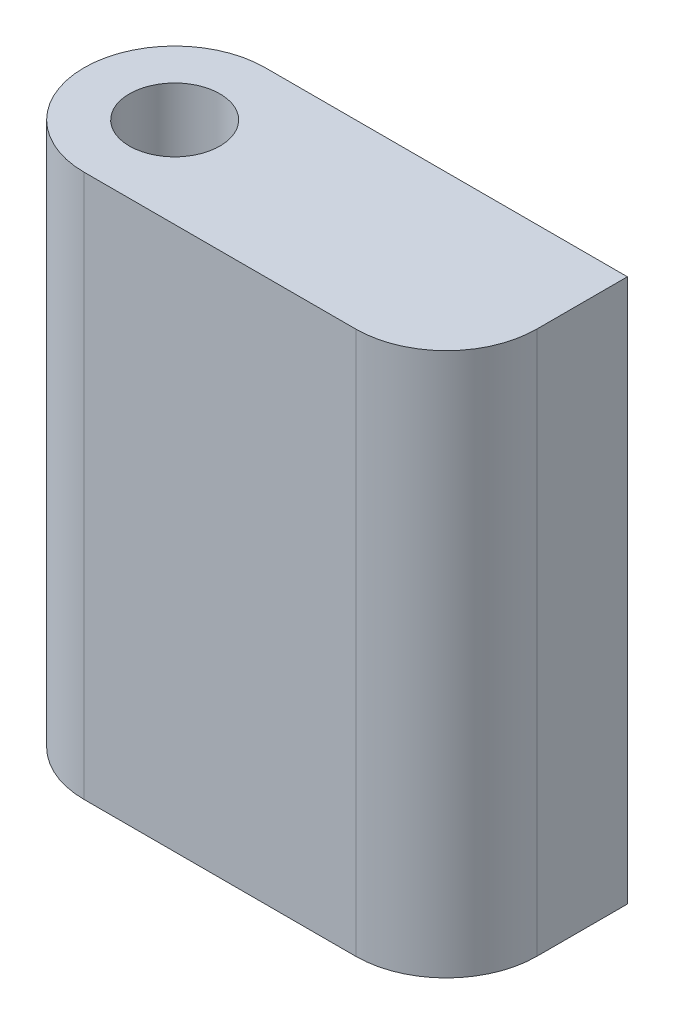
ISO-10303-21;
HEADER;
FILE_DESCRIPTION(('STEP AP214'),'2;1');
FILE_NAME('part.step','',(''),(''),'','','');
FILE_SCHEMA(('AUTOMOTIVE_DESIGN { 1 0 10303 214 1 1 1 1 }'));
ENDSEC;
DATA;
#1=APPLICATION_CONTEXT('core data for automotive mechanical design processes');
#2=APPLICATION_PROTOCOL_DEFINITION('international standard','automotive_design',2000,#1);
#3=PRODUCT_CONTEXT('',#1,'mechanical');
#4=PRODUCT('Part','Part','',(#3));
#5=PRODUCT_RELATED_PRODUCT_CATEGORY('part','',(#4));
#6=PRODUCT_DEFINITION_FORMATION('','',#4);
#7=PRODUCT_DEFINITION_CONTEXT('part definition',#1,'design');
#8=PRODUCT_DEFINITION('design','',#6,#7);
#9=PRODUCT_DEFINITION_SHAPE('','',#8);
#10=(LENGTH_UNIT() NAMED_UNIT(*) SI_UNIT(.MILLI.,.METRE.));
#11=(NAMED_UNIT(*) PLANE_ANGLE_UNIT() SI_UNIT($,.RADIAN.));
#12=(NAMED_UNIT(*) SI_UNIT($,.STERADIAN.) SOLID_ANGLE_UNIT());
#13=UNCERTAINTY_MEASURE_WITH_UNIT(LENGTH_MEASURE(1.E-05),#10,'distance_accuracy_value','');
#14=(GEOMETRIC_REPRESENTATION_CONTEXT(3) GLOBAL_UNCERTAINTY_ASSIGNED_CONTEXT((#13)) GLOBAL_UNIT_ASSIGNED_CONTEXT((#10,
#11,#12)) REPRESENTATION_CONTEXT('',''));
#15=CARTESIAN_POINT('',(0.,0.,0.));
#16=DIRECTION('',(0.,0.,1.));
#17=DIRECTION('',(1.,0.,0.));
#18=AXIS2_PLACEMENT_3D('',#15,#16,#17);
#19=CARTESIAN_POINT('',(0.,30.,0.));
#20=DIRECTION('',(0.,1.,0.));
#21=DIRECTION('',(0.,0.,1.));
#22=AXIS2_PLACEMENT_3D('',#19,#20,#21);
#23=PLANE('',#22);
#24=DIRECTION('',(1.,0.,0.));
#25=VECTOR('',#24,1.);
#26=CARTESIAN_POINT('',(20.,30.,5.));
#27=LINE('',#26,#25);
#28=CARTESIAN_POINT('',(0.,30.,5.));
#29=VERTEX_POINT('',#28);
#30=CARTESIAN_POINT('',(15.,30.,5.));
#31=VERTEX_POINT('',#30);
#32=EDGE_CURVE('E80',#29,#31,#27,.T.);
#33=ORIENTED_EDGE('',*,*,#32,.T.);
#34=CARTESIAN_POINT('',(15.,30.,0.));
#35=DIRECTION('',(0.,1.,0.));
#36=DIRECTION('',(0.,0.,1.));
#37=AXIS2_PLACEMENT_3D('',#34,#35,#36);
#38=CIRCLE('',#37,5.);
#39=CARTESIAN_POINT('',(20.,30.,0.));
#40=VERTEX_POINT('',#39);
#41=EDGE_CURVE('E11',#31,#40,#38,.T.);
#42=ORIENTED_EDGE('',*,*,#41,.T.);
#43=DIRECTION('',(0.,0.,-1.));
#44=VECTOR('',#43,1.);
#45=CARTESIAN_POINT('',(20.,30.,-5.));
#46=LINE('',#45,#44);
#47=CARTESIAN_POINT('',(20.,30.,-5.));
#48=VERTEX_POINT('',#47);
#49=EDGE_CURVE('E88',#40,#48,#46,.T.);
#50=ORIENTED_EDGE('',*,*,#49,.T.);
#51=DIRECTION('',(-1.,0.,0.));
#52=VECTOR('',#51,1.);
#53=CARTESIAN_POINT('',(0.,30.,-5.));
#54=LINE('',#53,#52);
#55=CARTESIAN_POINT('',(0.,30.,-5.));
#56=VERTEX_POINT('',#55);
#57=EDGE_CURVE('E94',#48,#56,#54,.T.);
#58=ORIENTED_EDGE('',*,*,#57,.T.);
#59=CARTESIAN_POINT('',(0.,30.,0.));
#60=DIRECTION('',(0.,1.,0.));
#61=DIRECTION('',(0.,0.,1.));
#62=AXIS2_PLACEMENT_3D('',#59,#60,#61);
#63=CIRCLE('',#62,5.);
#64=EDGE_CURVE('E89',#56,#29,#63,.T.);
#65=ORIENTED_EDGE('',*,*,#64,.T.);
#66=EDGE_LOOP('',(#33,#42,#50,#58,#65));
#67=FACE_BOUND('',#66,.T.);
#68=CARTESIAN_POINT('',(0.,30.,0.));
#69=DIRECTION('',(0.,1.,0.));
#70=DIRECTION('',(0.,0.,1.));
#71=AXIS2_PLACEMENT_3D('',#68,#69,#70);
#72=CIRCLE('',#71,2.5);
#73=CARTESIAN_POINT('',(0.,30.,2.5));
#74=VERTEX_POINT('',#73);
#75=EDGE_CURVE('E120',#74,#74,#72,.T.);
#76=ORIENTED_EDGE('',*,*,#75,.F.);
#77=EDGE_LOOP('',(#76));
#78=FACE_BOUND('',#77,.T.);
#79=ADVANCED_FACE('F37',(#67,#78),#23,.T.);
#80=CARTESIAN_POINT('',(0.,0.,0.));
#81=DIRECTION('',(0.,1.,0.));
#82=DIRECTION('',(0.,0.,1.));
#83=AXIS2_PLACEMENT_3D('',#80,#81,#82);
#84=PLANE('',#83);
#85=DIRECTION('',(0.,0.,-1.));
#86=VECTOR('',#85,1.);
#87=CARTESIAN_POINT('',(20.,0.,-5.));
#88=LINE('',#87,#86);
#89=CARTESIAN_POINT('',(20.,0.,0.));
#90=VERTEX_POINT('',#89);
#91=CARTESIAN_POINT('',(20.,0.,-5.));
#92=VERTEX_POINT('',#91);
#93=EDGE_CURVE('E115',#90,#92,#88,.T.);
#94=ORIENTED_EDGE('',*,*,#93,.F.);
#95=CARTESIAN_POINT('',(15.,0.,0.));
#96=DIRECTION('',(0.,1.,0.));
#97=DIRECTION('',(0.,0.,1.));
#98=AXIS2_PLACEMENT_3D('',#95,#96,#97);
#99=CIRCLE('',#98,5.);
#100=CARTESIAN_POINT('',(15.,0.,5.));
#101=VERTEX_POINT('',#100);
#102=EDGE_CURVE('E59',#90,#101,#99,.F.);
#103=ORIENTED_EDGE('',*,*,#102,.T.);
#104=DIRECTION('',(1.,0.,0.));
#105=VECTOR('',#104,1.);
#106=CARTESIAN_POINT('',(20.,0.,5.));
#107=LINE('',#106,#105);
#108=CARTESIAN_POINT('',(0.,0.,5.));
#109=VERTEX_POINT('',#108);
#110=EDGE_CURVE('E117',#109,#101,#107,.T.);
#111=ORIENTED_EDGE('',*,*,#110,.F.);
#112=CARTESIAN_POINT('',(0.,0.,0.));
#113=DIRECTION('',(0.,1.,0.));
#114=DIRECTION('',(0.,0.,1.));
#115=AXIS2_PLACEMENT_3D('',#112,#113,#114);
#116=CIRCLE('',#115,5.);
#117=CARTESIAN_POINT('',(0.,0.,-5.));
#118=VERTEX_POINT('',#117);
#119=EDGE_CURVE('E102',#118,#109,#116,.T.);
#120=ORIENTED_EDGE('',*,*,#119,.F.);
#121=DIRECTION('',(-1.,0.,0.));
#122=VECTOR('',#121,1.);
#123=CARTESIAN_POINT('',(0.,0.,-5.));
#124=LINE('',#123,#122);
#125=EDGE_CURVE('E98',#92,#118,#124,.T.);
#126=ORIENTED_EDGE('',*,*,#125,.F.);
#127=EDGE_LOOP('',(#94,#103,#111,#120,#126));
#128=FACE_BOUND('',#127,.T.);
#129=CARTESIAN_POINT('',(0.,0.,0.));
#130=DIRECTION('',(0.,1.,0.));
#131=DIRECTION('',(0.,0.,1.));
#132=AXIS2_PLACEMENT_3D('',#129,#130,#131);
#133=CIRCLE('',#132,2.5);
#134=CARTESIAN_POINT('',(0.,0.,2.5));
#135=VERTEX_POINT('',#134);
#136=EDGE_CURVE('E123',#135,#135,#133,.T.);
#137=ORIENTED_EDGE('',*,*,#136,.T.);
#138=EDGE_LOOP('',(#137));
#139=FACE_BOUND('',#138,.T.);
#140=ADVANCED_FACE('F132',(#128,#139),#84,.F.);
#141=CARTESIAN_POINT('',(0.,30.,0.));
#142=DIRECTION('',(0.,-1.,0.));
#143=DIRECTION('',(0.,0.,-1.));
#144=AXIS2_PLACEMENT_3D('',#141,#142,#143);
#145=CYLINDRICAL_SURFACE('',#144,5.);
#146=ORIENTED_EDGE('',*,*,#119,.T.);
#147=DIRECTION('',(0.,-1.,0.));
#148=VECTOR('',#147,1.);
#149=CARTESIAN_POINT('',(0.,30.,5.));
#150=LINE('',#149,#148);
#151=EDGE_CURVE('E84',#29,#109,#150,.T.);
#152=ORIENTED_EDGE('',*,*,#151,.F.);
#153=ORIENTED_EDGE('',*,*,#64,.F.);
#154=DIRECTION('',(0.,-1.,0.));
#155=VECTOR('',#154,1.);
#156=CARTESIAN_POINT('',(0.,30.,-5.));
#157=LINE('',#156,#155);
#158=EDGE_CURVE('E109',#56,#118,#157,.T.);
#159=ORIENTED_EDGE('',*,*,#158,.T.);
#160=EDGE_LOOP('',(#146,#152,#153,#159));
#161=FACE_BOUND('',#160,.T.);
#162=ADVANCED_FACE('F100',(#161),#145,.T.);
#163=CARTESIAN_POINT('',(20.,30.,5.));
#164=DIRECTION('',(0.,0.,-1.));
#165=DIRECTION('',(-1.,0.,0.));
#166=AXIS2_PLACEMENT_3D('',#163,#164,#165);
#167=PLANE('',#166);
#168=ORIENTED_EDGE('',*,*,#110,.T.);
#169=DIRECTION('',(0.,-1.,0.));
#170=VECTOR('',#169,1.);
#171=CARTESIAN_POINT('',(15.,30.,5.));
#172=LINE('',#171,#170);
#173=EDGE_CURVE('E45',#101,#31,#172,.F.);
#174=ORIENTED_EDGE('',*,*,#173,.T.);
#175=ORIENTED_EDGE('',*,*,#32,.F.);
#176=ORIENTED_EDGE('',*,*,#151,.T.);
#177=EDGE_LOOP('',(#168,#174,#175,#176));
#178=FACE_BOUND('',#177,.T.);
#179=ADVANCED_FACE('F82',(#178),#167,.F.);
#180=CARTESIAN_POINT('',(20.,30.,-5.));
#181=DIRECTION('',(-1.,0.,0.));
#182=DIRECTION('',(0.,0.,1.));
#183=AXIS2_PLACEMENT_3D('',#180,#181,#182);
#184=PLANE('',#183);
#185=ORIENTED_EDGE('',*,*,#49,.F.);
#186=DIRECTION('',(0.,-1.,0.));
#187=VECTOR('',#186,1.);
#188=CARTESIAN_POINT('',(20.,30.,0.));
#189=LINE('',#188,#187);
#190=EDGE_CURVE('E103',#40,#90,#189,.T.);
#191=ORIENTED_EDGE('',*,*,#190,.T.);
#192=ORIENTED_EDGE('',*,*,#93,.T.);
#193=DIRECTION('',(0.,-1.,0.));
#194=VECTOR('',#193,1.);
#195=CARTESIAN_POINT('',(20.,30.,-5.));
#196=LINE('',#195,#194);
#197=EDGE_CURVE('E104',#48,#92,#196,.T.);
#198=ORIENTED_EDGE('',*,*,#197,.F.);
#199=EDGE_LOOP('',(#185,#191,#192,#198));
#200=FACE_BOUND('',#199,.T.);
#201=ADVANCED_FACE('F143',(#200),#184,.F.);
#202=CARTESIAN_POINT('',(0.,30.,-5.));
#203=DIRECTION('',(0.,0.,1.));
#204=DIRECTION('',(1.,0.,0.));
#205=AXIS2_PLACEMENT_3D('',#202,#203,#204);
#206=PLANE('',#205);
#207=ORIENTED_EDGE('',*,*,#125,.T.);
#208=ORIENTED_EDGE('',*,*,#158,.F.);
#209=ORIENTED_EDGE('',*,*,#57,.F.);
#210=ORIENTED_EDGE('',*,*,#197,.T.);
#211=EDGE_LOOP('',(#207,#208,#209,#210));
#212=FACE_BOUND('',#211,.T.);
#213=ADVANCED_FACE('F140',(#212),#206,.F.);
#214=CARTESIAN_POINT('',(0.,30.,0.));
#215=DIRECTION('',(0.,-1.,0.));
#216=DIRECTION('',(0.,0.,-1.));
#217=AXIS2_PLACEMENT_3D('',#214,#215,#216);
#218=CYLINDRICAL_SURFACE('',#217,2.5);
#219=ORIENTED_EDGE('',*,*,#75,.T.);
#220=EDGE_LOOP('',(#219));
#221=FACE_BOUND('',#220,.T.);
#222=ORIENTED_EDGE('',*,*,#136,.F.);
#223=EDGE_LOOP('',(#222));
#224=FACE_BOUND('',#223,.T.);
#225=ADVANCED_FACE('F129',(#221,#224),#218,.F.);
#226=CARTESIAN_POINT('',(15.,30.,0.));
#227=DIRECTION('',(0.,-1.,0.));
#228=DIRECTION('',(0.,0.,-1.));
#229=AXIS2_PLACEMENT_3D('',#226,#227,#228);
#230=CYLINDRICAL_SURFACE('',#229,5.);
#231=ORIENTED_EDGE('',*,*,#41,.F.);
#232=ORIENTED_EDGE('',*,*,#173,.F.);
#233=ORIENTED_EDGE('',*,*,#102,.F.);
#234=ORIENTED_EDGE('',*,*,#190,.F.);
#235=EDGE_LOOP('',(#231,#232,#233,#234));
#236=FACE_BOUND('',#235,.T.);
#237=ADVANCED_FACE('F39',(#236),#230,.T.);
#238=CLOSED_SHELL('',(#79,#140,#162,#179,#201,#213,#225,#237));
#239=MANIFOLD_SOLID_BREP('B2',#238);
#240=ADVANCED_BREP_SHAPE_REPRESENTATION('',(#18,#239),#14);
#241=SHAPE_DEFINITION_REPRESENTATION(#9,#240);
ENDSEC;
END-ISO-10303-21;
